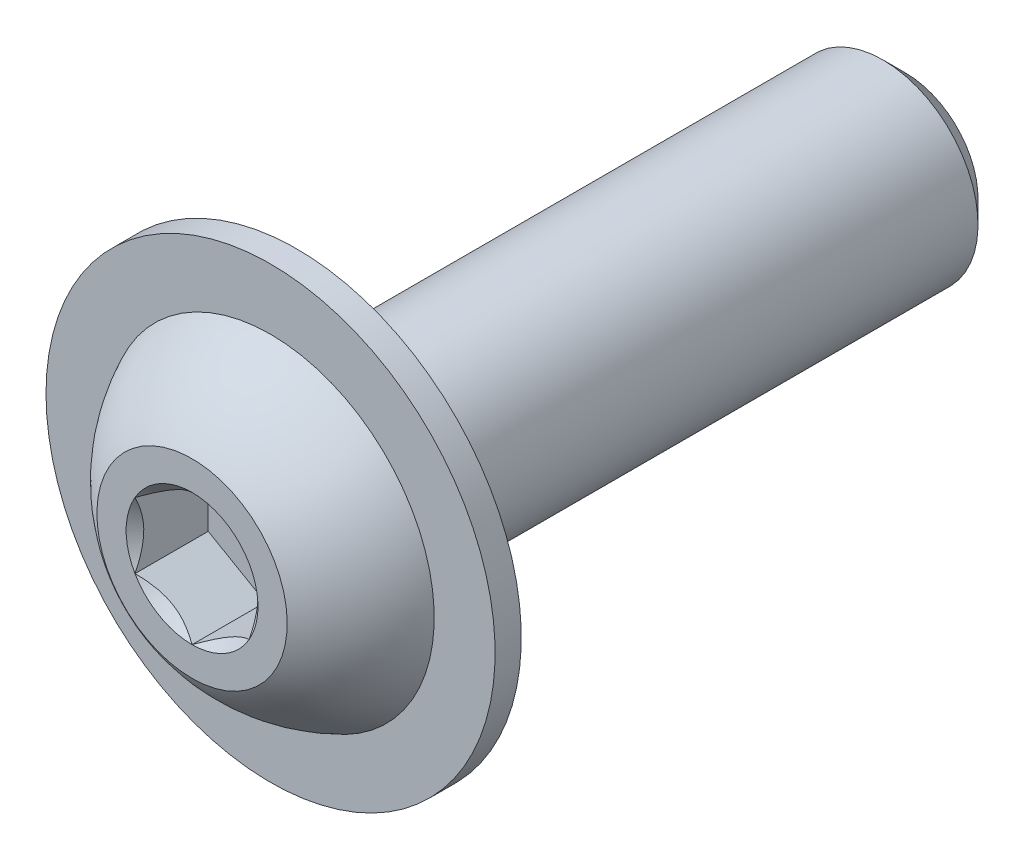
ISO-10303-21;
HEADER;
FILE_DESCRIPTION(('STEP AP214'),'2;1');
FILE_NAME('part.step','',(''),(''),'','','');
FILE_SCHEMA(('AUTOMOTIVE_DESIGN { 1 0 10303 214 1 1 1 1 }'));
ENDSEC;
DATA;
#1=APPLICATION_CONTEXT('core data for automotive mechanical design processes');
#2=APPLICATION_PROTOCOL_DEFINITION('international standard','automotive_design',2000,#1);
#3=PRODUCT_CONTEXT('',#1,'mechanical');
#4=PRODUCT('Part','Part','',(#3));
#5=PRODUCT_RELATED_PRODUCT_CATEGORY('part','',(#4));
#6=PRODUCT_DEFINITION_FORMATION('','',#4);
#7=PRODUCT_DEFINITION_CONTEXT('part definition',#1,'design');
#8=PRODUCT_DEFINITION('design','',#6,#7);
#9=PRODUCT_DEFINITION_SHAPE('','',#8);
#10=(LENGTH_UNIT() NAMED_UNIT(*) SI_UNIT(.MILLI.,.METRE.));
#11=(NAMED_UNIT(*) PLANE_ANGLE_UNIT() SI_UNIT($,.RADIAN.));
#12=(NAMED_UNIT(*) SI_UNIT($,.STERADIAN.) SOLID_ANGLE_UNIT());
#13=UNCERTAINTY_MEASURE_WITH_UNIT(LENGTH_MEASURE(1.E-05),#10,'distance_accuracy_value','');
#14=(GEOMETRIC_REPRESENTATION_CONTEXT(3) GLOBAL_UNCERTAINTY_ASSIGNED_CONTEXT((#13)) GLOBAL_UNIT_ASSIGNED_CONTEXT((#10,
#11,#12)) REPRESENTATION_CONTEXT('',''));
#15=CARTESIAN_POINT('',(0.,0.,0.));
#16=DIRECTION('',(0.,0.,1.));
#17=DIRECTION('',(1.,0.,0.));
#18=AXIS2_PLACEMENT_3D('',#15,#16,#17);
#19=CARTESIAN_POINT('',(0.,-2.5,-18.75));
#20=DIRECTION('',(0.,0.,-1.));
#21=DIRECTION('',(0.,1.,0.));
#22=AXIS2_PLACEMENT_3D('',#19,#20,#21);
#23=PLANE('',#22);
#24=CARTESIAN_POINT('',(0.,0.,-18.75));
#25=DIRECTION('',(0.,0.,-1.));
#26=DIRECTION('',(0.,1.,0.));
#27=AXIS2_PLACEMENT_3D('',#24,#25,#26);
#28=CIRCLE('',#27,1.9);
#29=CARTESIAN_POINT('',(0.,1.9,-18.75));
#30=VERTEX_POINT('',#29);
#31=EDGE_CURVE('E203',#30,#30,#28,.T.);
#32=ORIENTED_EDGE('',*,*,#31,.T.);
#33=EDGE_LOOP('',(#32));
#34=FACE_BOUND('',#33,.T.);
#35=ADVANCED_FACE('F41',(#34),#23,.T.);
#36=CARTESIAN_POINT('',(0.,0.,-18.75));
#37=DIRECTION('',(0.,0.,-1.));
#38=DIRECTION('',(0.,1.,0.));
#39=AXIS2_PLACEMENT_3D('',#36,#37,#38);
#40=CYLINDRICAL_SURFACE('',#39,2.5);
#41=CARTESIAN_POINT('',(0.,0.,-18.15));
#42=DIRECTION('',(0.,0.,-1.));
#43=DIRECTION('',(0.,1.,0.));
#44=AXIS2_PLACEMENT_3D('',#41,#42,#43);
#45=CIRCLE('',#44,2.5);
#46=CARTESIAN_POINT('',(0.,2.5,-18.15));
#47=VERTEX_POINT('',#46);
#48=EDGE_CURVE('E56',#47,#47,#45,.F.);
#49=ORIENTED_EDGE('',*,*,#48,.T.);
#50=EDGE_LOOP('',(#49));
#51=FACE_BOUND('',#50,.T.);
#52=CARTESIAN_POINT('',(0.,0.,-2.75));
#53=DIRECTION('',(0.,0.,1.));
#54=DIRECTION('',(1.,0.,0.));
#55=AXIS2_PLACEMENT_3D('',#52,#53,#54);
#56=CIRCLE('',#55,2.5);
#57=CARTESIAN_POINT('',(2.5,0.,-2.75));
#58=VERTEX_POINT('',#57);
#59=EDGE_CURVE('E199',#58,#58,#56,.F.);
#60=ORIENTED_EDGE('',*,*,#59,.T.);
#61=EDGE_LOOP('',(#60));
#62=FACE_BOUND('',#61,.T.);
#63=ADVANCED_FACE('F210',(#51,#62),#40,.T.);
#64=CARTESIAN_POINT('',(0.,0.,-18.75));
#65=DIRECTION('',(0.,0.,1.));
#66=DIRECTION('',(0.,-1.,0.));
#67=AXIS2_PLACEMENT_3D('',#64,#65,#66);
#68=CONICAL_SURFACE('',#67,1.9,0.785398163397447);
#69=ORIENTED_EDGE('',*,*,#48,.F.);
#70=EDGE_LOOP('',(#69));
#71=FACE_BOUND('',#70,.T.);
#72=ORIENTED_EDGE('',*,*,#31,.F.);
#73=EDGE_LOOP('',(#72));
#74=FACE_BOUND('',#73,.T.);
#75=ADVANCED_FACE('F43',(#71,#74),#68,.T.);
#76=CARTESIAN_POINT('',(0.,-4.3,-2.75));
#77=DIRECTION('',(0.,0.,1.));
#78=DIRECTION('',(1.,0.,0.));
#79=AXIS2_PLACEMENT_3D('',#76,#77,#78);
#80=PLANE('',#79);
#81=ORIENTED_EDGE('',*,*,#59,.F.);
#82=EDGE_LOOP('',(#81));
#83=FACE_BOUND('',#82,.T.);
#84=CARTESIAN_POINT('',(0.,0.,-2.75));
#85=DIRECTION('',(0.,0.,-1.));
#86=DIRECTION('',(-1.,0.,0.));
#87=AXIS2_PLACEMENT_3D('',#84,#85,#86);
#88=CIRCLE('',#87,5.9);
#89=CARTESIAN_POINT('',(-5.9,0.,-2.75));
#90=VERTEX_POINT('',#89);
#91=EDGE_CURVE('E188',#90,#90,#88,.T.);
#92=ORIENTED_EDGE('',*,*,#91,.T.);
#93=EDGE_LOOP('',(#92));
#94=FACE_BOUND('',#93,.T.);
#95=ADVANCED_FACE('F215',(#83,#94),#80,.F.);
#96=CARTESIAN_POINT('',(0.,0.,-2.0625));
#97=DIRECTION('',(0.,0.,-1.));
#98=DIRECTION('',(-1.,0.,0.));
#99=AXIS2_PLACEMENT_3D('',#96,#97,#98);
#100=PLANE('',#99);
#101=CARTESIAN_POINT('',(0.,0.,-2.0625));
#102=DIRECTION('',(0.,0.,-1.));
#103=DIRECTION('',(-1.,0.,0.));
#104=AXIS2_PLACEMENT_3D('',#101,#102,#103);
#105=CIRCLE('',#104,5.9);
#106=CARTESIAN_POINT('',(-5.9,0.,-2.0625));
#107=VERTEX_POINT('',#106);
#108=EDGE_CURVE('E183',#107,#107,#105,.T.);
#109=ORIENTED_EDGE('',*,*,#108,.F.);
#110=EDGE_LOOP('',(#109));
#111=FACE_BOUND('',#110,.T.);
#112=CARTESIAN_POINT('',(0.,0.,-2.0625));
#113=DIRECTION('',(0.,0.,-1.));
#114=DIRECTION('',(-1.,0.,0.));
#115=AXIS2_PLACEMENT_3D('',#112,#113,#114);
#116=CIRCLE('',#115,4.3);
#117=CARTESIAN_POINT('',(0.,-4.3,-2.0625));
#118=VERTEX_POINT('',#117);
#119=EDGE_CURVE('E187',#118,#118,#116,.T.);
#120=ORIENTED_EDGE('',*,*,#119,.T.);
#121=EDGE_LOOP('',(#120));
#122=FACE_BOUND('',#121,.T.);
#123=ADVANCED_FACE('F233',(#111,#122),#100,.F.);
#124=CARTESIAN_POINT('',(0.,0.,-2.0625));
#125=DIRECTION('',(0.,0.,-1.));
#126=DIRECTION('',(-1.,0.,0.));
#127=AXIS2_PLACEMENT_3D('',#124,#125,#126);
#128=CYLINDRICAL_SURFACE('',#127,5.9);
#129=ORIENTED_EDGE('',*,*,#108,.T.);
#130=EDGE_LOOP('',(#129));
#131=FACE_BOUND('',#130,.T.);
#132=ORIENTED_EDGE('',*,*,#91,.F.);
#133=EDGE_LOOP('',(#132));
#134=FACE_BOUND('',#133,.T.);
#135=ADVANCED_FACE('F230',(#131,#134),#128,.T.);
#136=CARTESIAN_POINT('',(0.,-2.5,0.));
#137=DIRECTION('',(0.,0.,-1.));
#138=DIRECTION('',(-1.,0.,0.));
#139=AXIS2_PLACEMENT_3D('',#136,#137,#138);
#140=PLANE('',#139);
#141=CARTESIAN_POINT('',(0.,0.,0.));
#142=DIRECTION('',(0.,0.,1.));
#143=DIRECTION('',(1.,0.,0.));
#144=AXIS2_PLACEMENT_3D('',#141,#142,#143);
#145=CIRCLE('',#144,1.73205080756888);
#146=CARTESIAN_POINT('',(-1.5,0.866025403784438,0.));
#147=VERTEX_POINT('',#146);
#148=CARTESIAN_POINT('',(-1.5,-0.86602540378444,0.));
#149=VERTEX_POINT('',#148);
#150=EDGE_CURVE('E69',#147,#149,#145,.T.);
#151=ORIENTED_EDGE('',*,*,#150,.F.);
#152=CARTESIAN_POINT('',(0.,1.73205080756888,0.));
#153=VERTEX_POINT('',#152);
#154=EDGE_CURVE('E146',#153,#147,#145,.T.);
#155=ORIENTED_EDGE('',*,*,#154,.F.);
#156=CARTESIAN_POINT('',(1.5,0.866025403784439,0.));
#157=VERTEX_POINT('',#156);
#158=EDGE_CURVE('E141',#157,#153,#145,.T.);
#159=ORIENTED_EDGE('',*,*,#158,.F.);
#160=CARTESIAN_POINT('',(1.5,-0.866025403784439,0.));
#161=VERTEX_POINT('',#160);
#162=EDGE_CURVE('E110',#161,#157,#145,.T.);
#163=ORIENTED_EDGE('',*,*,#162,.F.);
#164=CARTESIAN_POINT('',(0.,-1.73205080756888,0.));
#165=VERTEX_POINT('',#164);
#166=EDGE_CURVE('E101',#165,#161,#145,.T.);
#167=ORIENTED_EDGE('',*,*,#166,.F.);
#168=EDGE_CURVE('E62',#149,#165,#145,.T.);
#169=ORIENTED_EDGE('',*,*,#168,.F.);
#170=EDGE_LOOP('',(#151,#155,#159,#163,#167,#169));
#171=FACE_BOUND('',#170,.T.);
#172=CARTESIAN_POINT('',(0.,0.,0.));
#173=DIRECTION('',(0.,0.,1.));
#174=DIRECTION('',(1.,0.,0.));
#175=AXIS2_PLACEMENT_3D('',#172,#173,#174);
#176=CIRCLE('',#175,2.5);
#177=CARTESIAN_POINT('',(0.,-2.5,0.));
#178=VERTEX_POINT('',#177);
#179=EDGE_CURVE('E195',#178,#178,#176,.T.);
#180=ORIENTED_EDGE('',*,*,#179,.T.);
#181=EDGE_LOOP('',(#180));
#182=FACE_BOUND('',#181,.T.);
#183=ADVANCED_FACE('F138',(#171,#182),#140,.F.);
#184=CARTESIAN_POINT('',(0.,0.,-3.99852272727273));
#185=DIRECTION('',(0.,0.,1.));
#186=DIRECTION('',(0.,-1.,0.));
#187=AXIS2_PLACEMENT_3D('',#184,#185,#186);
#188=SPHERICAL_SURFACE('',#187,4.71573790625778);
#189=CARTESIAN_POINT('',(0.,-2.5,0.));
#190=CARTESIAN_POINT('',(0.,-2.52453175772071,-0.0153379749872106));
#191=CARTESIAN_POINT('',(0.,-2.54892232825722,-0.0309017640926039));
#192=CARTESIAN_POINT('',(0.,-2.59741291012247,-0.062475578982234));
#193=CARTESIAN_POINT('',(0.,-2.62151292145121,-0.0784856047664709));
#194=CARTESIAN_POINT('',(0.,-2.66941420006152,-0.110946501456265));
#195=CARTESIAN_POINT('',(0.,-2.6932154673431,-0.127397372361823));
#196=CARTESIAN_POINT('',(0.,-2.74051120059515,-0.160734377892812));
#197=CARTESIAN_POINT('',(0.,-2.76400566656564,-0.177620512518244));
#198=CARTESIAN_POINT('',(0.,-2.8106798367957,-0.211822327492261));
#199=CARTESIAN_POINT('',(0.,-2.83385954105528,-0.229138007840847));
#200=CARTESIAN_POINT('',(0.,-2.87989633598491,-0.264193047844881));
#201=CARTESIAN_POINT('',(0.,-2.90275342665495,-0.281932407500329));
#202=CARTESIAN_POINT('',(0.,-2.94813725130699,-0.317828796956838));
#203=CARTESIAN_POINT('',(0.,-2.97066398528898,-0.3359858267579));
#204=CARTESIAN_POINT('',(0.,-3.01537946551286,-0.37271140564706));
#205=CARTESIAN_POINT('',(0.,-3.03756821175476,-0.391279954735158));
#206=CARTESIAN_POINT('',(0.,-3.08160019990559,-0.428822281990869));
#207=CARTESIAN_POINT('',(0.,-3.10344344181452,-0.447796060158481));
#208=CARTESIAN_POINT('',(0.,-3.14677702175817,-0.486142418076665));
#209=CARTESIAN_POINT('',(0.,-3.1682673597929,-0.505514997827236));
#210=CARTESIAN_POINT('',(0.,-3.21088785199285,-0.544652396322111));
#211=CARTESIAN_POINT('',(0.,-3.23201800615807,-0.564417215066415));
#212=CARTESIAN_POINT('',(0.,-3.27391097263907,-0.604332396084892));
#213=CARTESIAN_POINT('',(0.,-3.29467378495484,-0.624482758359065));
#214=CARTESIAN_POINT('',(0.,-3.33582503419632,-0.665162200368271));
#215=CARTESIAN_POINT('',(0.,-3.35621347112203,-0.685691280103303));
#216=CARTESIAN_POINT('',(0.,-3.39660906286493,-0.727121202672086));
#217=CARTESIAN_POINT('',(0.,-3.41661621768214,-0.748022045505837));
#218=CARTESIAN_POINT('',(0.,-3.45624246765145,-0.790188413972716));
#219=CARTESIAN_POINT('',(0.,-3.47586156280355,-0.811453939605845));
#220=CARTESIAN_POINT('',(0.,-3.51470504734387,-0.854342469833415));
#221=CARTESIAN_POINT('',(0.,-3.53392943673208,-0.875965474427856));
#222=CARTESIAN_POINT('',(0.,-3.57197699735499,-0.919561637641613));
#223=CARTESIAN_POINT('',(0.,-3.5908001685897,-0.941534796260929));
#224=CARTESIAN_POINT('',(0.,-3.62803891643132,-0.985823823970996));
#225=CARTESIAN_POINT('',(0.,-3.64645449303824,-1.00813969306175));
#226=CARTESIAN_POINT('',(0.,-3.68287181322537,-1.0531065820658));
#227=CARTESIAN_POINT('',(0.,-3.70087355680559,-1.07575760197909));
#228=CARTESIAN_POINT('',(0.,-3.73645711272913,-1.12138711944478));
#229=CARTESIAN_POINT('',(0.,-3.75403892507245,-1.14436561699717));
#230=CARTESIAN_POINT('',(0.,-3.78877666256644,-1.19064230562236));
#231=CARTESIAN_POINT('',(0.,-3.80593258771712,-1.21394049669517));
#232=CARTESIAN_POINT('',(0.,-3.8398127391423,-1.26084867994418));
#233=CARTESIAN_POINT('',(0.,-3.8565369654168,-1.28445867212038));
#234=CARTESIAN_POINT('',(0.,-3.88954805364663,-1.33198245953463));
#235=CARTESIAN_POINT('',(0.,-3.90583491560196,-1.35589625477268));
#236=CARTESIAN_POINT('',(0.,-3.93796575791171,-1.40401954735318));
#237=CARTESIAN_POINT('',(0.,-3.95380973826612,-1.42822904469565));
#238=CARTESIAN_POINT('',(0.,-3.98504945011701,-1.47693554035857));
#239=CARTESIAN_POINT('',(0.,-4.00044518161349,-1.50143253867903));
#240=CARTESIAN_POINT('',(0.,-4.03078318035497,-1.55070573777102));
#241=CARTESIAN_POINT('',(0.,-4.04572544759997,-1.57548193854255));
#242=CARTESIAN_POINT('',(0.,-4.07515145599859,-1.62530514945658));
#243=CARTESIAN_POINT('',(0.,-4.08963519715221,-1.65035215959909));
#244=CARTESIAN_POINT('',(0.,-4.11813924708223,-1.70070850433005));
#245=CARTESIAN_POINT('',(0.,-4.13215955585862,-1.72601783891852));
#246=CARTESIAN_POINT('',(0.,-4.15973199089839,-1.77689025914952));
#247=CARTESIAN_POINT('',(0.,-4.17328411716177,-1.80245334479206));
#248=CARTESIAN_POINT('',(0.,-4.19991559877725,-1.85382460629679));
#249=CARTESIAN_POINT('',(0.,-4.21299495412934,-1.87963278215898));
#250=CARTESIAN_POINT('',(0.,-4.23867645396873,-1.93148548577613));
#251=CARTESIAN_POINT('',(0.,-4.25127859845602,-1.95753001353109));
#252=CARTESIAN_POINT('',(0.,-4.2760014419712,-2.00984658188987));
#253=CARTESIAN_POINT('',(0.,-4.28812214099909,-2.03611862249369));
#254=CARTESIAN_POINT('',(0.,-4.3,-2.0625));
#255=B_SPLINE_CURVE_WITH_KNOTS('',3,(#189,#190,#191,#192,#193,#194,#195,#196,#197,#198,#199,
#200,#201,#202,#203,#204,#205,#206,#207,#208,#209,#210,#211,#212,#213,#214,#215,#216,#217,#218,
#219,#220,#221,#222,#223,#224,#225,#226,#227,#228,#229,#230,#231,#232,#233,#234,#235,#236,#237,
#238,#239,#240,#241,#242,#243,#244,#245,#246,#247,#248,#249,#250,#251,#252,#253,#254),
.UNSPECIFIED.,.F.,.F.,(4,2,2,2,2,2,2,2,2,2,2,2,2,2,2,2,2,2,2,2,2,2,2,2,2,2,2,2,2,2,2,2,4),(0.,
0.0867947725836022,0.173589545167204,0.260384317750806,0.347179090334408,0.433973862918009,
0.520768635501612,0.607563408085214,0.694358180668815,0.781152953252417,0.867947725836019,
0.954742498419621,1.04153727100322,1.12833204358682,1.21512681617043,1.30192158875403,
1.38871636133763,1.47551113392123,1.56230590650483,1.64910067908844,1.73589545167204,
1.82269022425564,1.90948499683924,1.99627976942284,2.08307454200645,2.16986931459005,
2.25666408717365,2.34345885975725,2.43025363234085,2.51704840492446,2.60384317750806,
2.69063795009166,2.77743272267526),.UNSPECIFIED.);
#256=EDGE_CURVE('BSEAM224',#178,#118,#255,.T.);
#257=ORIENTED_EDGE('',*,*,#179,.F.);
#258=ORIENTED_EDGE('',*,*,#119,.F.);
#259=ORIENTED_EDGE('',*,*,#256,.T.);
#260=ORIENTED_EDGE('',*,*,#256,.F.);
#261=EDGE_LOOP('',(#257,#259,#258,#260));
#262=FACE_BOUND('',#261,.T.);
#263=ADVANCED_FACE('F224',(#262),#188,.T.);
#264=CARTESIAN_POINT('',(0.,0.,0.));
#265=DIRECTION('',(0.,0.,1.));
#266=DIRECTION('',(1.,0.,0.));
#267=AXIS2_PLACEMENT_3D('',#264,#265,#266);
#268=CONICAL_SURFACE('',#267,1.73205080756888,0.78539816339745);
#269=ORIENTED_EDGE('',*,*,#162,.T.);
#270=CARTESIAN_POINT('',(1.5,-1.72720812969692,0.555578516270791));
#271=CARTESIAN_POINT('',(1.5,-1.68515175699268,0.523829907857426));
#272=CARTESIAN_POINT('',(1.5,-1.64286104748673,0.492392593807383));
#273=CARTESIAN_POINT('',(1.5,-1.55771581035942,0.430269087556409));
#274=CARTESIAN_POINT('',(1.5,-1.51486114386668,0.399583085892202));
#275=CARTESIAN_POINT('',(1.5,-1.3846813415127,0.30840719242716));
#276=CARTESIAN_POINT('',(1.5,-1.29637976071654,0.249288343426773));
#277=CARTESIAN_POINT('',(1.5,-1.11121478730467,0.133230996316504));
#278=CARTESIAN_POINT('',(1.5,-1.01415038238167,0.0766095587330078));
#279=CARTESIAN_POINT('',(1.5,-0.815173408897605,-0.0269631187343472));
#280=CARTESIAN_POINT('',(1.5,-0.713278669253285,-0.0739469584583305));
#281=CARTESIAN_POINT('',(1.5,-0.560333774943111,-0.13142733156917));
#282=CARTESIAN_POINT('',(1.5,-0.511547982948042,-0.147924612242751));
#283=CARTESIAN_POINT('',(1.5,-0.412798620136866,-0.177002487072996));
#284=CARTESIAN_POINT('',(1.5,-0.362834968437562,-0.189582811405981));
#285=CARTESIAN_POINT('',(1.5,-0.262863235444982,-0.20996380585323));
#286=CARTESIAN_POINT('',(1.5,-0.212872113808022,-0.21784636725402));
#287=CARTESIAN_POINT('',(1.5,-0.112355243569545,-0.228677936030997));
#288=CARTESIAN_POINT('',(1.5,-0.0618295883726279,-0.231627791475649));
#289=CARTESIAN_POINT('',(1.5,0.037429173332384,-0.23237514227515));
#290=CARTESIAN_POINT('',(1.5,0.0861609672002989,-0.230355266441925));
#291=CARTESIAN_POINT('',(1.5,0.183206937768827,-0.221677447103242));
#292=CARTESIAN_POINT('',(1.5,0.231521073438269,-0.215019053031544));
#293=CARTESIAN_POINT('',(1.5,0.328199853425435,-0.197314755877433));
#294=CARTESIAN_POINT('',(1.5,0.376550616310328,-0.186194188742961));
#295=CARTESIAN_POINT('',(1.5,0.472195697125598,-0.160156585951288));
#296=CARTESIAN_POINT('',(1.5,0.51949010309274,-0.145239867959065));
#297=CARTESIAN_POINT('',(1.5,0.668391282696624,-0.0926647764039276));
#298=CARTESIAN_POINT('',(1.5,0.767878709508552,-0.0490187125280247));
#299=CARTESIAN_POINT('',(1.5,0.962179866690724,0.048022994593097));
#300=CARTESIAN_POINT('',(1.5,1.05697519961444,0.101453665089533));
#301=CARTESIAN_POINT('',(1.5,1.23814273533383,0.211685852004558));
#302=CARTESIAN_POINT('',(1.5,1.3246994218129,0.268187920698596));
#303=CARTESIAN_POINT('',(1.5,1.45222331290673,0.355534301578659));
#304=CARTESIAN_POINT('',(1.5,1.49418091978756,0.384957758680043));
#305=CARTESIAN_POINT('',(1.5,1.57752272931476,0.444582821830463));
#306=CARTESIAN_POINT('',(1.5,1.61890708647354,0.474784211664437));
#307=CARTESIAN_POINT('',(1.5,1.66005278019494,0.505308178609455));
#308=B_SPLINE_CURVE_WITH_KNOTS('',3,(#270,#271,#272,#273,#274,#275,#276,#277,#278,#279,#280,
#281,#282,#283,#284,#285,#286,#287,#288,#289,#290,#291,#292,#293,#294,#295,#296,#297,#298,#299,
#300,#301,#302,#303,#304,#305,#306,#307),.UNSPECIFIED.,.F.,.F.,(4,2,2,2,2,2,2,2,2,2,2,2,2,2,2,2,
2,2,4),(0.,0.158079548982668,0.316198780993942,0.634850417346958,0.97169031136151,
1.30737131660667,1.46173961127089,1.61611853740677,1.7677210142141,1.91929742368538,
2.065387412096,2.21149159305544,2.36014984633872,2.50879566386709,2.83376031422673,
3.15991186985652,3.46985601802197,3.62358896039974,3.7772796264207),.UNSPECIFIED.);
#309=EDGE_CURVE('E11',#161,#157,#308,.T.);
#310=ORIENTED_EDGE('',*,*,#309,.F.);
#311=EDGE_LOOP('',(#269,#310));
#312=FACE_BOUND('',#311,.T.);
#313=ADVANCED_FACE('F114',(#312),#268,.F.);
#314=ORIENTED_EDGE('',*,*,#158,.T.);
#315=CARTESIAN_POINT('',(1.5002,0.865909933730601,0.000115481600073575));
#316=CARTESIAN_POINT('',(1.44863220926292,0.895682611594166,-0.029634523932672));
#317=CARTESIAN_POINT('',(1.3962020823348,0.925953159489765,-0.0576375160896872));
#318=CARTESIAN_POINT('',(1.2892909659444,0.987678321317124,-0.108910769559857));
#319=CARTESIAN_POINT('',(1.23479980418534,1.01913880822718,-0.132152494955627));
#320=CARTESIAN_POINT('',(1.12492091864275,1.08257741237344,-0.17196627100778));
#321=CARTESIAN_POINT('',(1.0695611909048,1.11453936608521,-0.188638414329104));
#322=CARTESIAN_POINT('',(0.957622742522849,1.1791670593912,-0.214325543181897));
#323=CARTESIAN_POINT('',(0.901047443446991,1.21183082354213,-0.223359709521134));
#324=CARTESIAN_POINT('',(0.803544610483559,1.26812411040032,-0.231510918773148));
#325=CARTESIAN_POINT('',(0.762743091719533,1.29168087824208,-0.232717747010783));
#326=CARTESIAN_POINT('',(0.681212030384141,1.33875285845138,-0.230685942837733));
#327=CARTESIAN_POINT('',(0.64048250568537,1.36226806050018,-0.227446329251692));
#328=CARTESIAN_POINT('',(0.559415597836584,1.40907206156905,-0.216708014018038));
#329=CARTESIAN_POINT('',(0.519078615401711,1.43236062923612,-0.209205346981267));
#330=CARTESIAN_POINT('',(0.439081663085969,1.47854689118997,-0.190348388071709));
#331=CARTESIAN_POINT('',(0.399421991483791,1.50144441326545,-0.178992442981415));
#332=CARTESIAN_POINT('',(0.297836865225515,1.56009461325633,-0.145278352407328));
#333=CARTESIAN_POINT('',(0.236541446290311,1.59548353987866,-0.120378150906632));
#334=CARTESIAN_POINT('',(0.146414371536686,1.64751843074894,-0.0783433467284234));
#335=CARTESIAN_POINT('',(0.116714860092282,1.66466545167617,-0.0635748464409037));
#336=CARTESIAN_POINT('',(0.057862098616249,1.69864410935691,-0.0326894340598313));
#337=CARTESIAN_POINT('',(0.0287085957793627,1.71547589206761,-0.0165731658782896));
#338=CARTESIAN_POINT('',(-0.000199999999999918,1.73216627762272,0.000115481600073526));
#339=B_SPLINE_CURVE_WITH_KNOTS('',3,(#315,#316,#317,#318,#319,#320,#321,#322,#323,#324,#325,
#326,#327,#328,#329,#330,#331,#332,#333,#334,#335,#336,#337,#338),.UNSPECIFIED.,.F.,.F.,(4,2,2,
2,2,2,2,2,2,2,2,4),(0.,0.199829143693305,0.400822987382389,0.598623720538181,0.79592624018889,
0.937113067959882,1.07833105577193,1.21968061668222,1.36109089931054,1.58570969637565,
1.69770705470964,1.80965120737194),.UNSPECIFIED.);
#340=EDGE_CURVE('E145',#157,#153,#339,.T.);
#341=ORIENTED_EDGE('',*,*,#340,.F.);
#342=EDGE_LOOP('',(#314,#341));
#343=FACE_BOUND('',#342,.T.);
#344=ADVANCED_FACE('F330',(#343),#268,.F.);
#345=ORIENTED_EDGE('',*,*,#154,.T.);
#346=CARTESIAN_POINT('',(0.000200000000000145,1.73216627762272,0.000115481600073681));
#347=CARTESIAN_POINT('',(-0.0513677907370754,1.70239359975915,-0.0296345239326721));
#348=CARTESIAN_POINT('',(-0.103797917665201,1.67212305186355,-0.0576375160896872));
#349=CARTESIAN_POINT('',(-0.210709034055596,1.61039789003619,-0.108910769559857));
#350=CARTESIAN_POINT('',(-0.265200195814661,1.57893740312614,-0.132152494955627));
#351=CARTESIAN_POINT('',(-0.375079081357248,1.51549879897987,-0.17196627100778));
#352=CARTESIAN_POINT('',(-0.430438809095199,1.4835368452681,-0.188638414329104));
#353=CARTESIAN_POINT('',(-0.54237725747715,1.41890915196211,-0.214325543181897));
#354=CARTESIAN_POINT('',(-0.598952556553008,1.38624538781118,-0.223359709521134));
#355=CARTESIAN_POINT('',(-0.696455389516441,1.32995210095299,-0.231510918773148));
#356=CARTESIAN_POINT('',(-0.737256908280466,1.30639533311124,-0.232717747010784));
#357=CARTESIAN_POINT('',(-0.818787969615858,1.25932335290193,-0.230685942837733));
#358=CARTESIAN_POINT('',(-0.85951749431463,1.23580815085313,-0.227446329251693));
#359=CARTESIAN_POINT('',(-0.940584402163416,1.18900414978427,-0.216708014018039));
#360=CARTESIAN_POINT('',(-0.980921384598288,1.16571558211719,-0.209205346981267));
#361=CARTESIAN_POINT('',(-1.06091833691403,1.11952932016335,-0.19034838807171));
#362=CARTESIAN_POINT('',(-1.10057800851621,1.09663179808786,-0.178992442981416));
#363=CARTESIAN_POINT('',(-1.20216313477448,1.03798159809698,-0.145278352407329));
#364=CARTESIAN_POINT('',(-1.26345855370969,1.00259267147465,-0.120378150906633));
#365=CARTESIAN_POINT('',(-1.35358562846331,0.950557780604374,-0.0783433467284244));
#366=CARTESIAN_POINT('',(-1.38328513990772,0.933410759677147,-0.0635748464409047));
#367=CARTESIAN_POINT('',(-1.44213790138375,0.899432101996406,-0.0326894340598322));
#368=CARTESIAN_POINT('',(-1.47129140422064,0.882600319285709,-0.0165731658782905));
#369=CARTESIAN_POINT('',(-1.5002,0.8659099337306,0.000115481600072647));
#370=B_SPLINE_CURVE_WITH_KNOTS('',3,(#346,#347,#348,#349,#350,#351,#352,#353,#354,#355,#356,
#357,#358,#359,#360,#361,#362,#363,#364,#365,#366,#367,#368,#369),.UNSPECIFIED.,.F.,.F.,(4,2,2,
2,2,2,2,2,2,2,2,4),(0.,0.199829143693305,0.400822987382389,0.598623720538181,0.79592624018889,
0.937113067959882,1.07833105577193,1.21968061668222,1.36109089931054,1.58570969637565,
1.69770705470964,1.80965120737194),.UNSPECIFIED.);
#371=EDGE_CURVE('E152',#153,#147,#370,.T.);
#372=ORIENTED_EDGE('',*,*,#371,.F.);
#373=EDGE_LOOP('',(#345,#372));
#374=FACE_BOUND('',#373,.T.);
#375=ADVANCED_FACE('F157',(#374),#268,.F.);
#376=ORIENTED_EDGE('',*,*,#150,.T.);
#377=CARTESIAN_POINT('',(-1.5,-1.72720812969693,0.555578516270791));
#378=CARTESIAN_POINT('',(-1.5,-1.68515175699268,0.523829907857427));
#379=CARTESIAN_POINT('',(-1.5,-1.64286104748674,0.492392593807383));
#380=CARTESIAN_POINT('',(-1.5,-1.55771581035942,0.430269087556409));
#381=CARTESIAN_POINT('',(-1.5,-1.51486114386668,0.399583085892202));
#382=CARTESIAN_POINT('',(-1.5,-1.3846813415127,0.30840719242716));
#383=CARTESIAN_POINT('',(-1.5,-1.29637976071654,0.249288343426773));
#384=CARTESIAN_POINT('',(-1.5,-1.11121478730467,0.133230996316504));
#385=CARTESIAN_POINT('',(-1.5,-1.01415038238167,0.0766095587330076));
#386=CARTESIAN_POINT('',(-1.5,-0.815173408897606,-0.0269631187343476));
#387=CARTESIAN_POINT('',(-1.5,-0.713278669253285,-0.0739469584583312));
#388=CARTESIAN_POINT('',(-1.5,-0.560333774943112,-0.131427331569171));
#389=CARTESIAN_POINT('',(-1.5,-0.511547982948042,-0.147924612242752));
#390=CARTESIAN_POINT('',(-1.5,-0.412798620136867,-0.177002487072996));
#391=CARTESIAN_POINT('',(-1.5,-0.362834968437563,-0.189582811405982));
#392=CARTESIAN_POINT('',(-1.5,-0.262863235444982,-0.209963805853231));
#393=CARTESIAN_POINT('',(-1.5,-0.212872113808023,-0.21784636725402));
#394=CARTESIAN_POINT('',(-1.5,-0.112355243569546,-0.228677936030997));
#395=CARTESIAN_POINT('',(-1.5,-0.0618295883726282,-0.23162779147565));
#396=CARTESIAN_POINT('',(-1.5,0.0374291733323837,-0.232375142275151));
#397=CARTESIAN_POINT('',(-1.5,0.0861609672002987,-0.230355266441926));
#398=CARTESIAN_POINT('',(-1.5,0.183206937768827,-0.221677447103242));
#399=CARTESIAN_POINT('',(-1.5,0.231521073438269,-0.215019053031544));
#400=CARTESIAN_POINT('',(-1.5,0.328199853425436,-0.197314755877433));
#401=CARTESIAN_POINT('',(-1.5,0.376550616310328,-0.186194188742962));
#402=CARTESIAN_POINT('',(-1.5,0.472195697125598,-0.160156585951289));
#403=CARTESIAN_POINT('',(-1.5,0.51949010309274,-0.145239867959065));
#404=CARTESIAN_POINT('',(-1.5,0.668391282696624,-0.0926647764039282));
#405=CARTESIAN_POINT('',(-1.5,0.767878709508552,-0.0490187125280255));
#406=CARTESIAN_POINT('',(-1.5,0.962179866690723,0.0480229945930961));
#407=CARTESIAN_POINT('',(-1.5,1.05697519961444,0.101453665089532));
#408=CARTESIAN_POINT('',(-1.5,1.23814273533383,0.211685852004557));
#409=CARTESIAN_POINT('',(-1.5,1.3246994218129,0.268187920698595));
#410=CARTESIAN_POINT('',(-1.5,1.45222331290673,0.355534301578659));
#411=CARTESIAN_POINT('',(-1.5,1.49418091978756,0.384957758680042));
#412=CARTESIAN_POINT('',(-1.5,1.57752272931476,0.444582821830463));
#413=CARTESIAN_POINT('',(-1.5,1.61890708647354,0.474784211664436));
#414=CARTESIAN_POINT('',(-1.5,1.66005278019494,0.505308178609455));
#415=B_SPLINE_CURVE_WITH_KNOTS('',3,(#377,#378,#379,#380,#381,#382,#383,#384,#385,#386,#387,
#388,#389,#390,#391,#392,#393,#394,#395,#396,#397,#398,#399,#400,#401,#402,#403,#404,#405,#406,
#407,#408,#409,#410,#411,#412,#413,#414),.UNSPECIFIED.,.F.,.F.,(4,2,2,2,2,2,2,2,2,2,2,2,2,2,2,2,
2,2,4),(0.,0.158079548982669,0.316198780993942,0.634850417346959,0.971690311361511,
1.30737131660667,1.46173961127089,1.61611853740677,1.7677210142141,1.91929742368538,
2.065387412096,2.21149159305544,2.36014984633872,2.5087956638671,2.83376031422673,
3.15991186985652,3.46985601802198,3.62358896039974,3.77727962642071),.UNSPECIFIED.);
#416=EDGE_CURVE('E162',#147,#149,#415,.F.);
#417=ORIENTED_EDGE('',*,*,#416,.F.);
#418=EDGE_LOOP('',(#376,#417));
#419=FACE_BOUND('',#418,.T.);
#420=ADVANCED_FACE('F324',(#419),#268,.F.);
#421=ORIENTED_EDGE('',*,*,#168,.T.);
#422=CARTESIAN_POINT('',(-1.5002,-0.865909933730601,0.000115481600072708));
#423=CARTESIAN_POINT('',(-1.44863220926292,-0.895682611594166,-0.0296345239326731));
#424=CARTESIAN_POINT('',(-1.3962020823348,-0.925953159489765,-0.0576375160896882));
#425=CARTESIAN_POINT('',(-1.2892909659444,-0.987678321317123,-0.108910769559858));
#426=CARTESIAN_POINT('',(-1.23479980418534,-1.01913880822717,-0.132152494955628));
#427=CARTESIAN_POINT('',(-1.12492091864275,-1.08257741237344,-0.171966271007781));
#428=CARTESIAN_POINT('',(-1.0695611909048,-1.11453936608521,-0.188638414329104));
#429=CARTESIAN_POINT('',(-0.957622742522849,-1.1791670593912,-0.214325543181897));
#430=CARTESIAN_POINT('',(-0.901047443446991,-1.21183082354213,-0.223359709521135));
#431=CARTESIAN_POINT('',(-0.803544610483559,-1.26812411040032,-0.231510918773148));
#432=CARTESIAN_POINT('',(-0.762743091719533,-1.29168087824208,-0.232717747010784));
#433=CARTESIAN_POINT('',(-0.681212030384142,-1.33875285845138,-0.230685942837733));
#434=CARTESIAN_POINT('',(-0.64048250568537,-1.36226806050018,-0.227446329251693));
#435=CARTESIAN_POINT('',(-0.559415597836584,-1.40907206156905,-0.216708014018039));
#436=CARTESIAN_POINT('',(-0.519078615401712,-1.43236062923612,-0.209205346981267));
#437=CARTESIAN_POINT('',(-0.439081663085969,-1.47854689118996,-0.19034838807171));
#438=CARTESIAN_POINT('',(-0.399421991483792,-1.50144441326545,-0.178992442981415));
#439=CARTESIAN_POINT('',(-0.297836865225515,-1.56009461325633,-0.145278352407329));
#440=CARTESIAN_POINT('',(-0.23654144629031,-1.59548353987866,-0.120378150906633));
#441=CARTESIAN_POINT('',(-0.146414371536686,-1.64751843074894,-0.0783433467284239));
#442=CARTESIAN_POINT('',(-0.116714860092281,-1.66466545167617,-0.0635748464409041));
#443=CARTESIAN_POINT('',(-0.0578620986162481,-1.69864410935691,-0.0326894340598315));
#444=CARTESIAN_POINT('',(-0.0287085957793618,-1.71547589206761,-0.0165731658782897));
#445=CARTESIAN_POINT('',(0.00020000000000104,-1.73216627762272,0.000115481600073612));
#446=B_SPLINE_CURVE_WITH_KNOTS('',3,(#422,#423,#424,#425,#426,#427,#428,#429,#430,#431,#432,
#433,#434,#435,#436,#437,#438,#439,#440,#441,#442,#443,#444,#445),.UNSPECIFIED.,.F.,.F.,(4,2,2,
2,2,2,2,2,2,2,2,4),(0.,0.199829143693305,0.400822987382389,0.59862372053818,0.795926240188889,
0.937113067959881,1.07833105577193,1.21968061668222,1.36109089931054,1.58570969637565,
1.69770705470964,1.80965120737194),.UNSPECIFIED.);
#447=EDGE_CURVE('E127',#149,#165,#446,.T.);
#448=ORIENTED_EDGE('',*,*,#447,.F.);
#449=EDGE_LOOP('',(#421,#448));
#450=FACE_BOUND('',#449,.T.);
#451=ADVANCED_FACE('F263',(#450),#268,.F.);
#452=ORIENTED_EDGE('',*,*,#166,.T.);
#453=CARTESIAN_POINT('',(-0.000199999999998985,-1.73216627762272,0.000115481600073681));
#454=CARTESIAN_POINT('',(0.0513677907370768,-1.70239359975915,-0.029634523932672));
#455=CARTESIAN_POINT('',(0.103797917665202,-1.67212305186355,-0.0576375160896872));
#456=CARTESIAN_POINT('',(0.210709034055598,-1.61039789003619,-0.108910769559857));
#457=CARTESIAN_POINT('',(0.265200195814662,-1.57893740312614,-0.132152494955627));
#458=CARTESIAN_POINT('',(0.37507908135725,-1.51549879897987,-0.17196627100778));
#459=CARTESIAN_POINT('',(0.430438809095201,-1.4835368452681,-0.188638414329103));
#460=CARTESIAN_POINT('',(0.542377257477151,-1.41890915196211,-0.214325543181897));
#461=CARTESIAN_POINT('',(0.598952556553009,-1.38624538781118,-0.223359709521134));
#462=CARTESIAN_POINT('',(0.696455389516442,-1.32995210095299,-0.231510918773148));
#463=CARTESIAN_POINT('',(0.737256908280467,-1.30639533311124,-0.232717747010783));
#464=CARTESIAN_POINT('',(0.818787969615859,-1.25932335290193,-0.230685942837732));
#465=CARTESIAN_POINT('',(0.859517494314631,-1.23580815085313,-0.227446329251692));
#466=CARTESIAN_POINT('',(0.940584402163417,-1.18900414978427,-0.216708014018038));
#467=CARTESIAN_POINT('',(0.980921384598289,-1.16571558211719,-0.209205346981267));
#468=CARTESIAN_POINT('',(1.06091833691403,-1.11952932016335,-0.190348388071709));
#469=CARTESIAN_POINT('',(1.10057800851621,-1.09663179808786,-0.178992442981415));
#470=CARTESIAN_POINT('',(1.20216313477449,-1.03798159809698,-0.145278352407328));
#471=CARTESIAN_POINT('',(1.26345855370969,-1.00259267147465,-0.120378150906633));
#472=CARTESIAN_POINT('',(1.35358562846331,-0.950557780604374,-0.0783433467284235));
#473=CARTESIAN_POINT('',(1.38328513990772,-0.933410759677147,-0.0635748464409038));
#474=CARTESIAN_POINT('',(1.44213790138375,-0.899432101996407,-0.0326894340598314));
#475=CARTESIAN_POINT('',(1.47129140422064,-0.88260031928571,-0.0165731658782897));
#476=CARTESIAN_POINT('',(1.5002,-0.865909933730601,0.000115481600073299));
#477=B_SPLINE_CURVE_WITH_KNOTS('',3,(#453,#454,#455,#456,#457,#458,#459,#460,#461,#462,#463,
#464,#465,#466,#467,#468,#469,#470,#471,#472,#473,#474,#475,#476),.UNSPECIFIED.,.F.,.F.,(4,2,2,
2,2,2,2,2,2,2,2,4),(0.,0.199829143693305,0.400822987382389,0.598623720538181,0.795926240188889,
0.937113067959881,1.07833105577193,1.21968061668222,1.36109089931054,1.58570969637565,
1.69770705470964,1.80965120737194),.UNSPECIFIED.);
#478=EDGE_CURVE('E105',#165,#161,#477,.T.);
#479=ORIENTED_EDGE('',*,*,#478,.F.);
#480=EDGE_LOOP('',(#452,#479));
#481=FACE_BOUND('',#480,.T.);
#482=ADVANCED_FACE('F103',(#481),#268,.F.);
#483=CARTESIAN_POINT('',(1.5,-0.866025403784438,-1.925));
#484=DIRECTION('',(0.,0.,1.));
#485=DIRECTION('',(1.,0.,0.));
#486=AXIS2_PLACEMENT_3D('',#483,#484,#485);
#487=PLANE('',#486);
#488=DIRECTION('',(0.866025403784438,0.5,0.));
#489=VECTOR('',#488,1.);
#490=CARTESIAN_POINT('',(0.,-1.73205080756888,-1.925));
#491=LINE('',#490,#489);
#492=CARTESIAN_POINT('',(0.,-1.73205080756888,-1.925));
#493=VERTEX_POINT('',#492);
#494=CARTESIAN_POINT('',(1.5,-0.866025403784438,-1.925));
#495=VERTEX_POINT('',#494);
#496=EDGE_CURVE('E126',#493,#495,#491,.T.);
#497=ORIENTED_EDGE('',*,*,#496,.T.);
#498=DIRECTION('',(0.,1.,0.));
#499=VECTOR('',#498,1.);
#500=CARTESIAN_POINT('',(1.5,-0.866025403784438,-1.925));
#501=LINE('',#500,#499);
#502=CARTESIAN_POINT('',(1.5,0.866025403784439,-1.925));
#503=VERTEX_POINT('',#502);
#504=EDGE_CURVE('E131',#495,#503,#501,.T.);
#505=ORIENTED_EDGE('',*,*,#504,.T.);
#506=DIRECTION('',(-0.866025403784439,0.5,0.));
#507=VECTOR('',#506,1.);
#508=CARTESIAN_POINT('',(1.5,0.866025403784439,-1.925));
#509=LINE('',#508,#507);
#510=CARTESIAN_POINT('',(0.,1.73205080756888,-1.925));
#511=VERTEX_POINT('',#510);
#512=EDGE_CURVE('E308',#503,#511,#509,.T.);
#513=ORIENTED_EDGE('',*,*,#512,.T.);
#514=DIRECTION('',(-0.866025403784438,-0.5,0.));
#515=VECTOR('',#514,1.);
#516=CARTESIAN_POINT('',(0.,1.73205080756888,-1.925));
#517=LINE('',#516,#515);
#518=CARTESIAN_POINT('',(-1.5,0.866025403784438,-1.925));
#519=VERTEX_POINT('',#518);
#520=EDGE_CURVE('E171',#511,#519,#517,.T.);
#521=ORIENTED_EDGE('',*,*,#520,.T.);
#522=DIRECTION('',(0.,-1.,0.));
#523=VECTOR('',#522,1.);
#524=CARTESIAN_POINT('',(-1.5,0.866025403784438,-1.925));
#525=LINE('',#524,#523);
#526=CARTESIAN_POINT('',(-1.5,-0.866025403784438,-1.925));
#527=VERTEX_POINT('',#526);
#528=EDGE_CURVE('E314',#519,#527,#525,.T.);
#529=ORIENTED_EDGE('',*,*,#528,.T.);
#530=DIRECTION('',(0.866025403784439,-0.5,0.));
#531=VECTOR('',#530,1.);
#532=CARTESIAN_POINT('',(-1.5,-0.866025403784438,-1.925));
#533=LINE('',#532,#531);
#534=EDGE_CURVE('E135',#527,#493,#533,.T.);
#535=ORIENTED_EDGE('',*,*,#534,.T.);
#536=EDGE_LOOP('',(#497,#505,#513,#521,#529,#535));
#537=FACE_BOUND('',#536,.T.);
#538=ADVANCED_FACE('F262',(#537),#487,.T.);
#539=CARTESIAN_POINT('',(1.5,-0.866025403784438,-1.925));
#540=DIRECTION('',(1.,0.,0.));
#541=DIRECTION('',(0.,0.,-1.));
#542=AXIS2_PLACEMENT_3D('',#539,#540,#541);
#543=PLANE('',#542);
#544=DIRECTION('',(0.,0.,1.));
#545=VECTOR('',#544,1.);
#546=CARTESIAN_POINT('',(1.5,-0.866025403784438,-1.925));
#547=LINE('',#546,#545);
#548=EDGE_CURVE('E122',#495,#161,#547,.T.);
#549=ORIENTED_EDGE('',*,*,#548,.T.);
#550=ORIENTED_EDGE('',*,*,#309,.T.);
#551=DIRECTION('',(0.,0.,1.));
#552=VECTOR('',#551,1.);
#553=CARTESIAN_POINT('',(1.5,0.866025403784439,-1.925));
#554=LINE('',#553,#552);
#555=EDGE_CURVE('E134',#503,#157,#554,.T.);
#556=ORIENTED_EDGE('',*,*,#555,.F.);
#557=ORIENTED_EDGE('',*,*,#504,.F.);
#558=EDGE_LOOP('',(#549,#550,#556,#557));
#559=FACE_BOUND('',#558,.T.);
#560=ADVANCED_FACE('F129',(#559),#543,.F.);
#561=CARTESIAN_POINT('',(1.5,0.866025403784439,-1.925));
#562=DIRECTION('',(0.5,0.866025403784439,0.));
#563=DIRECTION('',(-0.866025403784439,0.5,0.));
#564=AXIS2_PLACEMENT_3D('',#561,#562,#563);
#565=PLANE('',#564);
#566=ORIENTED_EDGE('',*,*,#555,.T.);
#567=ORIENTED_EDGE('',*,*,#340,.T.);
#568=DIRECTION('',(0.,0.,1.));
#569=VECTOR('',#568,1.);
#570=CARTESIAN_POINT('',(0.,1.73205080756888,-1.925));
#571=LINE('',#570,#569);
#572=EDGE_CURVE('E167',#511,#153,#571,.T.);
#573=ORIENTED_EDGE('',*,*,#572,.F.);
#574=ORIENTED_EDGE('',*,*,#512,.F.);
#575=EDGE_LOOP('',(#566,#567,#573,#574));
#576=FACE_BOUND('',#575,.T.);
#577=ADVANCED_FACE('F165',(#576),#565,.F.);
#578=CARTESIAN_POINT('',(0.,1.73205080756888,-1.925));
#579=DIRECTION('',(-0.5,0.866025403784438,0.));
#580=DIRECTION('',(-0.866025403784438,-0.5,0.));
#581=AXIS2_PLACEMENT_3D('',#578,#579,#580);
#582=PLANE('',#581);
#583=ORIENTED_EDGE('',*,*,#572,.T.);
#584=ORIENTED_EDGE('',*,*,#371,.T.);
#585=DIRECTION('',(0.,0.,1.));
#586=VECTOR('',#585,1.);
#587=CARTESIAN_POINT('',(-1.5,0.866025403784438,-1.925));
#588=LINE('',#587,#586);
#589=EDGE_CURVE('E174',#519,#147,#588,.T.);
#590=ORIENTED_EDGE('',*,*,#589,.F.);
#591=ORIENTED_EDGE('',*,*,#520,.F.);
#592=EDGE_LOOP('',(#583,#584,#590,#591));
#593=FACE_BOUND('',#592,.T.);
#594=ADVANCED_FACE('F169',(#593),#582,.F.);
#595=CARTESIAN_POINT('',(-1.5,0.866025403784438,-1.925));
#596=DIRECTION('',(-1.,0.,0.));
#597=DIRECTION('',(0.,0.,1.));
#598=AXIS2_PLACEMENT_3D('',#595,#596,#597);
#599=PLANE('',#598);
#600=ORIENTED_EDGE('',*,*,#589,.T.);
#601=ORIENTED_EDGE('',*,*,#416,.T.);
#602=DIRECTION('',(0.,0.,1.));
#603=VECTOR('',#602,1.);
#604=CARTESIAN_POINT('',(-1.5,-0.866025403784438,-1.925));
#605=LINE('',#604,#603);
#606=EDGE_CURVE('E178',#527,#149,#605,.T.);
#607=ORIENTED_EDGE('',*,*,#606,.F.);
#608=ORIENTED_EDGE('',*,*,#528,.F.);
#609=EDGE_LOOP('',(#600,#601,#607,#608));
#610=FACE_BOUND('',#609,.T.);
#611=ADVANCED_FACE('F285',(#610),#599,.F.);
#612=CARTESIAN_POINT('',(-1.5,-0.866025403784438,-1.925));
#613=DIRECTION('',(-0.5,-0.866025403784439,0.));
#614=DIRECTION('',(0.866025403784439,-0.5,0.));
#615=AXIS2_PLACEMENT_3D('',#612,#613,#614);
#616=PLANE('',#615);
#617=ORIENTED_EDGE('',*,*,#606,.T.);
#618=ORIENTED_EDGE('',*,*,#447,.T.);
#619=DIRECTION('',(0.,0.,1.));
#620=VECTOR('',#619,1.);
#621=CARTESIAN_POINT('',(0.,-1.73205080756888,-1.925));
#622=LINE('',#621,#620);
#623=EDGE_CURVE('E124',#493,#165,#622,.T.);
#624=ORIENTED_EDGE('',*,*,#623,.F.);
#625=ORIENTED_EDGE('',*,*,#534,.F.);
#626=EDGE_LOOP('',(#617,#618,#624,#625));
#627=FACE_BOUND('',#626,.T.);
#628=ADVANCED_FACE('F243',(#627),#616,.F.);
#629=CARTESIAN_POINT('',(0.,-1.73205080756888,-1.925));
#630=DIRECTION('',(0.5,-0.866025403784438,0.));
#631=DIRECTION('',(0.866025403784438,0.5,0.));
#632=AXIS2_PLACEMENT_3D('',#629,#630,#631);
#633=PLANE('',#632);
#634=ORIENTED_EDGE('',*,*,#623,.T.);
#635=ORIENTED_EDGE('',*,*,#478,.T.);
#636=ORIENTED_EDGE('',*,*,#548,.F.);
#637=ORIENTED_EDGE('',*,*,#496,.F.);
#638=EDGE_LOOP('',(#634,#635,#636,#637));
#639=FACE_BOUND('',#638,.T.);
#640=ADVANCED_FACE('F120',(#639),#633,.F.);
#641=CLOSED_SHELL('',(#35,#63,#75,#95,#123,#135,#183,#263,#313,#344,#375,#420,#451,#482,#538,
#560,#577,#594,#611,#628,#640));
#642=MANIFOLD_SOLID_BREP('B2',#641);
#643=ADVANCED_BREP_SHAPE_REPRESENTATION('',(#18,#642),#14);
#644=SHAPE_DEFINITION_REPRESENTATION(#9,#643);
ENDSEC;
END-ISO-10303-21;
